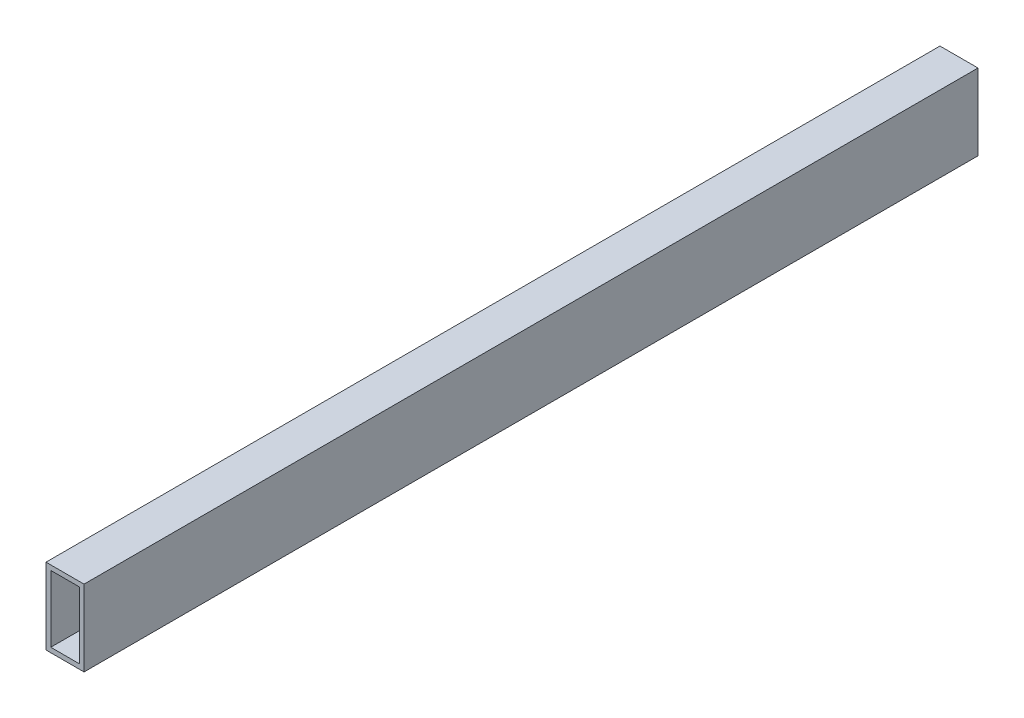
ISO-10303-21;
HEADER;
FILE_DESCRIPTION(('STEP AP214'),'2;1');
FILE_NAME('part.step','',(''),(''),'','','');
FILE_SCHEMA(('AUTOMOTIVE_DESIGN { 1 0 10303 214 1 1 1 1 }'));
ENDSEC;
DATA;
#1=APPLICATION_CONTEXT('core data for automotive mechanical design processes');
#2=APPLICATION_PROTOCOL_DEFINITION('international standard','automotive_design',2000,#1);
#3=PRODUCT_CONTEXT('',#1,'mechanical');
#4=PRODUCT('Part','Part','',(#3));
#5=PRODUCT_RELATED_PRODUCT_CATEGORY('part','',(#4));
#6=PRODUCT_DEFINITION_FORMATION('','',#4);
#7=PRODUCT_DEFINITION_CONTEXT('part definition',#1,'design');
#8=PRODUCT_DEFINITION('design','',#6,#7);
#9=PRODUCT_DEFINITION_SHAPE('','',#8);
#10=(LENGTH_UNIT() NAMED_UNIT(*) SI_UNIT(.MILLI.,.METRE.));
#11=(NAMED_UNIT(*) PLANE_ANGLE_UNIT() SI_UNIT($,.RADIAN.));
#12=(NAMED_UNIT(*) SI_UNIT($,.STERADIAN.) SOLID_ANGLE_UNIT());
#13=UNCERTAINTY_MEASURE_WITH_UNIT(LENGTH_MEASURE(1.E-05),#10,'distance_accuracy_value','');
#14=(GEOMETRIC_REPRESENTATION_CONTEXT(3) GLOBAL_UNCERTAINTY_ASSIGNED_CONTEXT((#13)) GLOBAL_UNIT_ASSIGNED_CONTEXT((#10,
#11,#12)) REPRESENTATION_CONTEXT('',''));
#15=CARTESIAN_POINT('',(0.,0.,0.));
#16=DIRECTION('',(0.,0.,1.));
#17=DIRECTION('',(1.,0.,0.));
#18=AXIS2_PLACEMENT_3D('',#15,#16,#17);
#19=CARTESIAN_POINT('',(0.,0.,596.9));
#20=DIRECTION('',(0.,0.,-1.));
#21=DIRECTION('',(-1.,0.,0.));
#22=AXIS2_PLACEMENT_3D('',#19,#20,#21);
#23=PLANE('',#22);
#24=DIRECTION('',(0.,1.,0.));
#25=VECTOR('',#24,1.);
#26=CARTESIAN_POINT('',(12.7,-25.4,596.9));
#27=LINE('',#26,#25);
#28=CARTESIAN_POINT('',(12.7,-25.4,596.9));
#29=VERTEX_POINT('',#28);
#30=CARTESIAN_POINT('',(12.7,25.4,596.9));
#31=VERTEX_POINT('',#30);
#32=EDGE_CURVE('E133',#29,#31,#27,.T.);
#33=ORIENTED_EDGE('',*,*,#32,.T.);
#34=DIRECTION('',(-1.,0.,0.));
#35=VECTOR('',#34,1.);
#36=CARTESIAN_POINT('',(-12.7,25.4,596.9));
#37=LINE('',#36,#35);
#38=CARTESIAN_POINT('',(-12.7,25.4,596.9));
#39=VERTEX_POINT('',#38);
#40=EDGE_CURVE('E136',#31,#39,#37,.T.);
#41=ORIENTED_EDGE('',*,*,#40,.T.);
#42=DIRECTION('',(0.,-1.,0.));
#43=VECTOR('',#42,1.);
#44=CARTESIAN_POINT('',(-12.7,-25.4,596.9));
#45=LINE('',#44,#43);
#46=CARTESIAN_POINT('',(-12.7,-25.4,596.9));
#47=VERTEX_POINT('',#46);
#48=EDGE_CURVE('E139',#39,#47,#45,.T.);
#49=ORIENTED_EDGE('',*,*,#48,.T.);
#50=DIRECTION('',(1.,0.,0.));
#51=VECTOR('',#50,1.);
#52=CARTESIAN_POINT('',(-12.7,-25.4,596.9));
#53=LINE('',#52,#51);
#54=EDGE_CURVE('E141',#47,#29,#53,.T.);
#55=ORIENTED_EDGE('',*,*,#54,.T.);
#56=EDGE_LOOP('',(#33,#41,#49,#55));
#57=FACE_BOUND('',#56,.T.);
#58=DIRECTION('',(0.,-1.,0.));
#59=VECTOR('',#58,1.);
#60=CARTESIAN_POINT('',(-9.525,-22.225,596.9));
#61=LINE('',#60,#59);
#62=CARTESIAN_POINT('',(-9.525,22.225,596.9));
#63=VERTEX_POINT('',#62);
#64=CARTESIAN_POINT('',(-9.525,-22.225,596.9));
#65=VERTEX_POINT('',#64);
#66=EDGE_CURVE('E97',#63,#65,#61,.T.);
#67=ORIENTED_EDGE('',*,*,#66,.F.);
#68=DIRECTION('',(-1.,0.,0.));
#69=VECTOR('',#68,1.);
#70=CARTESIAN_POINT('',(-9.525,22.225,596.9));
#71=LINE('',#70,#69);
#72=CARTESIAN_POINT('',(9.525,22.225,596.9));
#73=VERTEX_POINT('',#72);
#74=EDGE_CURVE('E119',#73,#63,#71,.T.);
#75=ORIENTED_EDGE('',*,*,#74,.F.);
#76=DIRECTION('',(0.,1.,0.));
#77=VECTOR('',#76,1.);
#78=CARTESIAN_POINT('',(9.525,-22.225,596.9));
#79=LINE('',#78,#77);
#80=CARTESIAN_POINT('',(9.525,-22.225,596.9));
#81=VERTEX_POINT('',#80);
#82=EDGE_CURVE('E117',#81,#73,#79,.T.);
#83=ORIENTED_EDGE('',*,*,#82,.F.);
#84=DIRECTION('',(1.,0.,0.));
#85=VECTOR('',#84,1.);
#86=CARTESIAN_POINT('',(-9.525,-22.225,596.9));
#87=LINE('',#86,#85);
#88=EDGE_CURVE('E105',#65,#81,#87,.T.);
#89=ORIENTED_EDGE('',*,*,#88,.F.);
#90=EDGE_LOOP('',(#67,#75,#83,#89));
#91=FACE_BOUND('',#90,.T.);
#92=ADVANCED_FACE('F32',(#57,#91),#23,.F.);
#93=CARTESIAN_POINT('',(0.,0.,0.));
#94=DIRECTION('',(0.,0.,-1.));
#95=DIRECTION('',(-1.,0.,0.));
#96=AXIS2_PLACEMENT_3D('',#93,#94,#95);
#97=PLANE('',#96);
#98=DIRECTION('',(0.,1.,0.));
#99=VECTOR('',#98,1.);
#100=CARTESIAN_POINT('',(12.7,-25.4,0.));
#101=LINE('',#100,#99);
#102=CARTESIAN_POINT('',(12.7,-25.4,0.));
#103=VERTEX_POINT('',#102);
#104=CARTESIAN_POINT('',(12.7,25.4,0.));
#105=VERTEX_POINT('',#104);
#106=EDGE_CURVE('E113',#103,#105,#101,.T.);
#107=ORIENTED_EDGE('',*,*,#106,.F.);
#108=DIRECTION('',(1.,0.,0.));
#109=VECTOR('',#108,1.);
#110=CARTESIAN_POINT('',(-12.7,-25.4,0.));
#111=LINE('',#110,#109);
#112=CARTESIAN_POINT('',(-12.7,-25.4,0.));
#113=VERTEX_POINT('',#112);
#114=EDGE_CURVE('E137',#113,#103,#111,.T.);
#115=ORIENTED_EDGE('',*,*,#114,.F.);
#116=DIRECTION('',(0.,-1.,0.));
#117=VECTOR('',#116,1.);
#118=CARTESIAN_POINT('',(-12.7,-25.4,0.));
#119=LINE('',#118,#117);
#120=CARTESIAN_POINT('',(-12.7,25.4,0.));
#121=VERTEX_POINT('',#120);
#122=EDGE_CURVE('E148',#121,#113,#119,.T.);
#123=ORIENTED_EDGE('',*,*,#122,.F.);
#124=DIRECTION('',(-1.,0.,0.));
#125=VECTOR('',#124,1.);
#126=CARTESIAN_POINT('',(-12.7,25.4,0.));
#127=LINE('',#126,#125);
#128=EDGE_CURVE('E146',#105,#121,#127,.T.);
#129=ORIENTED_EDGE('',*,*,#128,.F.);
#130=EDGE_LOOP('',(#107,#115,#123,#129));
#131=FACE_BOUND('',#130,.T.);
#132=DIRECTION('',(-1.,0.,0.));
#133=VECTOR('',#132,1.);
#134=CARTESIAN_POINT('',(-9.525,22.225,0.));
#135=LINE('',#134,#133);
#136=CARTESIAN_POINT('',(9.525,22.225,0.));
#137=VERTEX_POINT('',#136);
#138=CARTESIAN_POINT('',(-9.525,22.225,0.));
#139=VERTEX_POINT('',#138);
#140=EDGE_CURVE('E106',#137,#139,#135,.T.);
#141=ORIENTED_EDGE('',*,*,#140,.T.);
#142=DIRECTION('',(0.,-1.,0.));
#143=VECTOR('',#142,1.);
#144=CARTESIAN_POINT('',(-9.525,-22.225,0.));
#145=LINE('',#144,#143);
#146=CARTESIAN_POINT('',(-9.525,-22.225,0.));
#147=VERTEX_POINT('',#146);
#148=EDGE_CURVE('E55',#139,#147,#145,.T.);
#149=ORIENTED_EDGE('',*,*,#148,.T.);
#150=DIRECTION('',(1.,0.,0.));
#151=VECTOR('',#150,1.);
#152=CARTESIAN_POINT('',(-9.525,-22.225,0.));
#153=LINE('',#152,#151);
#154=CARTESIAN_POINT('',(9.525,-22.225,0.));
#155=VERTEX_POINT('',#154);
#156=EDGE_CURVE('E112',#147,#155,#153,.T.);
#157=ORIENTED_EDGE('',*,*,#156,.T.);
#158=DIRECTION('',(0.,1.,0.));
#159=VECTOR('',#158,1.);
#160=CARTESIAN_POINT('',(9.525,-22.225,0.));
#161=LINE('',#160,#159);
#162=EDGE_CURVE('E125',#155,#137,#161,.T.);
#163=ORIENTED_EDGE('',*,*,#162,.T.);
#164=EDGE_LOOP('',(#141,#149,#157,#163));
#165=FACE_BOUND('',#164,.T.);
#166=ADVANCED_FACE('F166',(#131,#165),#97,.T.);
#167=CARTESIAN_POINT('',(12.7,-25.4,596.9));
#168=DIRECTION('',(-1.,0.,0.));
#169=DIRECTION('',(0.,0.,1.));
#170=AXIS2_PLACEMENT_3D('',#167,#168,#169);
#171=PLANE('',#170);
#172=ORIENTED_EDGE('',*,*,#106,.T.);
#173=DIRECTION('',(0.,0.,-1.));
#174=VECTOR('',#173,1.);
#175=CARTESIAN_POINT('',(12.7,25.4,596.9));
#176=LINE('',#175,#174);
#177=EDGE_CURVE('E11',#31,#105,#176,.T.);
#178=ORIENTED_EDGE('',*,*,#177,.F.);
#179=ORIENTED_EDGE('',*,*,#32,.F.);
#180=DIRECTION('',(0.,0.,-1.));
#181=VECTOR('',#180,1.);
#182=CARTESIAN_POINT('',(12.7,-25.4,596.9));
#183=LINE('',#182,#181);
#184=EDGE_CURVE('E143',#29,#103,#183,.T.);
#185=ORIENTED_EDGE('',*,*,#184,.T.);
#186=EDGE_LOOP('',(#172,#178,#179,#185));
#187=FACE_BOUND('',#186,.T.);
#188=ADVANCED_FACE('F34',(#187),#171,.F.);
#189=CARTESIAN_POINT('',(-12.7,25.4,596.9));
#190=DIRECTION('',(0.,-1.,0.));
#191=DIRECTION('',(0.,0.,-1.));
#192=AXIS2_PLACEMENT_3D('',#189,#190,#191);
#193=PLANE('',#192);
#194=ORIENTED_EDGE('',*,*,#128,.T.);
#195=DIRECTION('',(0.,0.,-1.));
#196=VECTOR('',#195,1.);
#197=CARTESIAN_POINT('',(-12.7,25.4,596.9));
#198=LINE('',#197,#196);
#199=EDGE_CURVE('E40',#39,#121,#198,.T.);
#200=ORIENTED_EDGE('',*,*,#199,.F.);
#201=ORIENTED_EDGE('',*,*,#40,.F.);
#202=ORIENTED_EDGE('',*,*,#177,.T.);
#203=EDGE_LOOP('',(#194,#200,#201,#202));
#204=FACE_BOUND('',#203,.T.);
#205=ADVANCED_FACE('F176',(#204),#193,.F.);
#206=CARTESIAN_POINT('',(-12.7,-25.4,596.9));
#207=DIRECTION('',(1.,0.,0.));
#208=DIRECTION('',(0.,0.,-1.));
#209=AXIS2_PLACEMENT_3D('',#206,#207,#208);
#210=PLANE('',#209);
#211=ORIENTED_EDGE('',*,*,#122,.T.);
#212=DIRECTION('',(0.,0.,-1.));
#213=VECTOR('',#212,1.);
#214=CARTESIAN_POINT('',(-12.7,-25.4,596.9));
#215=LINE('',#214,#213);
#216=EDGE_CURVE('E153',#47,#113,#215,.T.);
#217=ORIENTED_EDGE('',*,*,#216,.F.);
#218=ORIENTED_EDGE('',*,*,#48,.F.);
#219=ORIENTED_EDGE('',*,*,#199,.T.);
#220=EDGE_LOOP('',(#211,#217,#218,#219));
#221=FACE_BOUND('',#220,.T.);
#222=ADVANCED_FACE('F160',(#221),#210,.F.);
#223=CARTESIAN_POINT('',(-12.7,-25.4,596.9));
#224=DIRECTION('',(0.,1.,0.));
#225=DIRECTION('',(0.,0.,1.));
#226=AXIS2_PLACEMENT_3D('',#223,#224,#225);
#227=PLANE('',#226);
#228=ORIENTED_EDGE('',*,*,#114,.T.);
#229=ORIENTED_EDGE('',*,*,#184,.F.);
#230=ORIENTED_EDGE('',*,*,#54,.F.);
#231=ORIENTED_EDGE('',*,*,#216,.T.);
#232=EDGE_LOOP('',(#228,#229,#230,#231));
#233=FACE_BOUND('',#232,.T.);
#234=ADVANCED_FACE('F170',(#233),#227,.F.);
#235=CARTESIAN_POINT('',(-9.525,-22.225,596.9));
#236=DIRECTION('',(1.,0.,0.));
#237=DIRECTION('',(0.,0.,-1.));
#238=AXIS2_PLACEMENT_3D('',#235,#236,#237);
#239=PLANE('',#238);
#240=ORIENTED_EDGE('',*,*,#148,.F.);
#241=DIRECTION('',(0.,0.,-1.));
#242=VECTOR('',#241,1.);
#243=CARTESIAN_POINT('',(-9.525,22.225,596.9));
#244=LINE('',#243,#242);
#245=EDGE_CURVE('E101',#63,#139,#244,.T.);
#246=ORIENTED_EDGE('',*,*,#245,.F.);
#247=ORIENTED_EDGE('',*,*,#66,.T.);
#248=DIRECTION('',(0.,0.,-1.));
#249=VECTOR('',#248,1.);
#250=CARTESIAN_POINT('',(-9.525,-22.225,596.9));
#251=LINE('',#250,#249);
#252=EDGE_CURVE('E100',#65,#147,#251,.T.);
#253=ORIENTED_EDGE('',*,*,#252,.T.);
#254=EDGE_LOOP('',(#240,#246,#247,#253));
#255=FACE_BOUND('',#254,.T.);
#256=ADVANCED_FACE('F99',(#255),#239,.T.);
#257=CARTESIAN_POINT('',(-9.525,-22.225,596.9));
#258=DIRECTION('',(0.,1.,0.));
#259=DIRECTION('',(0.,0.,1.));
#260=AXIS2_PLACEMENT_3D('',#257,#258,#259);
#261=PLANE('',#260);
#262=ORIENTED_EDGE('',*,*,#156,.F.);
#263=ORIENTED_EDGE('',*,*,#252,.F.);
#264=ORIENTED_EDGE('',*,*,#88,.T.);
#265=DIRECTION('',(0.,0.,-1.));
#266=VECTOR('',#265,1.);
#267=CARTESIAN_POINT('',(9.525,-22.225,596.9));
#268=LINE('',#267,#266);
#269=EDGE_CURVE('E114',#81,#155,#268,.T.);
#270=ORIENTED_EDGE('',*,*,#269,.T.);
#271=EDGE_LOOP('',(#262,#263,#264,#270));
#272=FACE_BOUND('',#271,.T.);
#273=ADVANCED_FACE('F109',(#272),#261,.T.);
#274=CARTESIAN_POINT('',(9.525,-22.225,596.9));
#275=DIRECTION('',(-1.,0.,0.));
#276=DIRECTION('',(0.,0.,1.));
#277=AXIS2_PLACEMENT_3D('',#274,#275,#276);
#278=PLANE('',#277);
#279=ORIENTED_EDGE('',*,*,#162,.F.);
#280=ORIENTED_EDGE('',*,*,#269,.F.);
#281=ORIENTED_EDGE('',*,*,#82,.T.);
#282=DIRECTION('',(0.,0.,-1.));
#283=VECTOR('',#282,1.);
#284=CARTESIAN_POINT('',(9.525,22.225,596.9));
#285=LINE('',#284,#283);
#286=EDGE_CURVE('E47',#73,#137,#285,.T.);
#287=ORIENTED_EDGE('',*,*,#286,.T.);
#288=EDGE_LOOP('',(#279,#280,#281,#287));
#289=FACE_BOUND('',#288,.T.);
#290=ADVANCED_FACE('F199',(#289),#278,.T.);
#291=CARTESIAN_POINT('',(-9.525,22.225,596.9));
#292=DIRECTION('',(0.,-1.,0.));
#293=DIRECTION('',(1.,0.,0.));
#294=AXIS2_PLACEMENT_3D('',#291,#292,#293);
#295=PLANE('',#294);
#296=ORIENTED_EDGE('',*,*,#140,.F.);
#297=ORIENTED_EDGE('',*,*,#286,.F.);
#298=ORIENTED_EDGE('',*,*,#74,.T.);
#299=ORIENTED_EDGE('',*,*,#245,.T.);
#300=EDGE_LOOP('',(#296,#297,#298,#299));
#301=FACE_BOUND('',#300,.T.);
#302=ADVANCED_FACE('F203',(#301),#295,.T.);
#303=CLOSED_SHELL('',(#92,#166,#188,#205,#222,#234,#256,#273,#290,#302));
#304=MANIFOLD_SOLID_BREP('B2',#303);
#305=ADVANCED_BREP_SHAPE_REPRESENTATION('',(#18,#304),#14);
#306=SHAPE_DEFINITION_REPRESENTATION(#9,#305);
ENDSEC;
END-ISO-10303-21;
